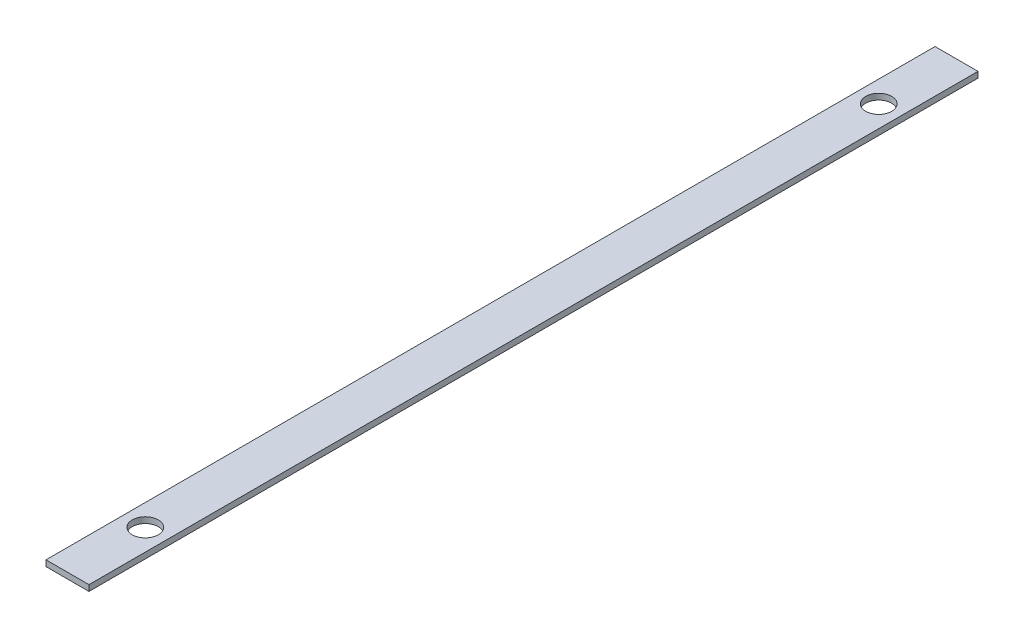
ISO-10303-21;
HEADER;
FILE_DESCRIPTION(('STEP AP214'),'2;1');
FILE_NAME('part.step','',(''),(''),'','','');
FILE_SCHEMA(('AUTOMOTIVE_DESIGN { 1 0 10303 214 1 1 1 1 }'));
ENDSEC;
DATA;
#1=APPLICATION_CONTEXT('core data for automotive mechanical design processes');
#2=APPLICATION_PROTOCOL_DEFINITION('international standard','automotive_design',2000,#1);
#3=PRODUCT_CONTEXT('',#1,'mechanical');
#4=PRODUCT('Part','Part','',(#3));
#5=PRODUCT_RELATED_PRODUCT_CATEGORY('part','',(#4));
#6=PRODUCT_DEFINITION_FORMATION('','',#4);
#7=PRODUCT_DEFINITION_CONTEXT('part definition',#1,'design');
#8=PRODUCT_DEFINITION('design','',#6,#7);
#9=PRODUCT_DEFINITION_SHAPE('','',#8);
#10=(LENGTH_UNIT() NAMED_UNIT(*) SI_UNIT(.MILLI.,.METRE.));
#11=(NAMED_UNIT(*) PLANE_ANGLE_UNIT() SI_UNIT($,.RADIAN.));
#12=(NAMED_UNIT(*) SI_UNIT($,.STERADIAN.) SOLID_ANGLE_UNIT());
#13=UNCERTAINTY_MEASURE_WITH_UNIT(LENGTH_MEASURE(1.E-05),#10,'distance_accuracy_value','');
#14=(GEOMETRIC_REPRESENTATION_CONTEXT(3) GLOBAL_UNCERTAINTY_ASSIGNED_CONTEXT((#13)) GLOBAL_UNIT_ASSIGNED_CONTEXT((#10,
#11,#12)) REPRESENTATION_CONTEXT('',''));
#15=CARTESIAN_POINT('',(0.,0.,0.));
#16=DIRECTION('',(0.,0.,1.));
#17=DIRECTION('',(1.,0.,0.));
#18=AXIS2_PLACEMENT_3D('',#15,#16,#17);
#19=CARTESIAN_POINT('',(-2.9,-0.4,60.));
#20=DIRECTION('',(1.,0.,0.));
#21=DIRECTION('',(0.,0.,-1.));
#22=AXIS2_PLACEMENT_3D('',#19,#20,#21);
#23=PLANE('',#22);
#24=DIRECTION('',(0.,-1.,0.));
#25=VECTOR('',#24,1.);
#26=CARTESIAN_POINT('',(-2.9,-0.4,-60.));
#27=LINE('',#26,#25);
#28=CARTESIAN_POINT('',(-2.9,0.4,-60.));
#29=VERTEX_POINT('',#28);
#30=CARTESIAN_POINT('',(-2.9,-0.4,-60.));
#31=VERTEX_POINT('',#30);
#32=EDGE_CURVE('E105',#29,#31,#27,.T.);
#33=ORIENTED_EDGE('',*,*,#32,.T.);
#34=DIRECTION('',(0.,0.,-1.));
#35=VECTOR('',#34,1.);
#36=CARTESIAN_POINT('',(-2.9,-0.4,60.));
#37=LINE('',#36,#35);
#38=CARTESIAN_POINT('',(-2.9,-0.4,60.));
#39=VERTEX_POINT('',#38);
#40=EDGE_CURVE('E11',#39,#31,#37,.T.);
#41=ORIENTED_EDGE('',*,*,#40,.F.);
#42=DIRECTION('',(0.,-1.,0.));
#43=VECTOR('',#42,1.);
#44=CARTESIAN_POINT('',(-2.9,-0.4,60.));
#45=LINE('',#44,#43);
#46=CARTESIAN_POINT('',(-2.9,0.4,60.));
#47=VERTEX_POINT('',#46);
#48=EDGE_CURVE('E89',#47,#39,#45,.T.);
#49=ORIENTED_EDGE('',*,*,#48,.F.);
#50=DIRECTION('',(0.,0.,-1.));
#51=VECTOR('',#50,1.);
#52=CARTESIAN_POINT('',(-2.9,0.4,60.));
#53=LINE('',#52,#51);
#54=EDGE_CURVE('E98',#47,#29,#53,.T.);
#55=ORIENTED_EDGE('',*,*,#54,.T.);
#56=EDGE_LOOP('',(#33,#41,#49,#55));
#57=FACE_BOUND('',#56,.T.);
#58=ADVANCED_FACE('F39',(#57),#23,.F.);
#59=CARTESIAN_POINT('',(-2.9,-0.4,60.));
#60=DIRECTION('',(0.,1.,0.));
#61=DIRECTION('',(0.,0.,1.));
#62=AXIS2_PLACEMENT_3D('',#59,#60,#61);
#63=PLANE('',#62);
#64=CARTESIAN_POINT('',(0.,-0.4,49.5));
#65=DIRECTION('',(0.,1.,0.));
#66=DIRECTION('',(0.,0.,1.));
#67=AXIS2_PLACEMENT_3D('',#64,#65,#66);
#68=CIRCLE('',#67,1.75);
#69=CARTESIAN_POINT('',(0.,-0.4,51.25));
#70=VERTEX_POINT('',#69);
#71=EDGE_CURVE('E104',#70,#70,#68,.F.);
#72=ORIENTED_EDGE('',*,*,#71,.F.);
#73=EDGE_LOOP('',(#72));
#74=FACE_BOUND('',#73,.T.);
#75=CARTESIAN_POINT('',(0.,-0.4,-49.5));
#76=DIRECTION('',(0.,1.,0.));
#77=DIRECTION('',(0.,0.,1.));
#78=AXIS2_PLACEMENT_3D('',#75,#76,#77);
#79=CIRCLE('',#78,1.75);
#80=CARTESIAN_POINT('',(0.,-0.4,-47.75));
#81=VERTEX_POINT('',#80);
#82=EDGE_CURVE('E118',#81,#81,#79,.F.);
#83=ORIENTED_EDGE('',*,*,#82,.F.);
#84=EDGE_LOOP('',(#83));
#85=FACE_BOUND('',#84,.T.);
#86=DIRECTION('',(1.,0.,0.));
#87=VECTOR('',#86,1.);
#88=CARTESIAN_POINT('',(-2.9,-0.4,-60.));
#89=LINE('',#88,#87);
#90=CARTESIAN_POINT('',(2.9,-0.4,-60.));
#91=VERTEX_POINT('',#90);
#92=EDGE_CURVE('E94',#31,#91,#89,.T.);
#93=ORIENTED_EDGE('',*,*,#92,.T.);
#94=DIRECTION('',(0.,0.,-1.));
#95=VECTOR('',#94,1.);
#96=CARTESIAN_POINT('',(2.9,-0.4,60.));
#97=LINE('',#96,#95);
#98=CARTESIAN_POINT('',(2.9,-0.4,60.));
#99=VERTEX_POINT('',#98);
#100=EDGE_CURVE('E50',#99,#91,#97,.T.);
#101=ORIENTED_EDGE('',*,*,#100,.F.);
#102=DIRECTION('',(1.,0.,0.));
#103=VECTOR('',#102,1.);
#104=CARTESIAN_POINT('',(-2.9,-0.4,60.));
#105=LINE('',#104,#103);
#106=EDGE_CURVE('E83',#39,#99,#105,.T.);
#107=ORIENTED_EDGE('',*,*,#106,.F.);
#108=ORIENTED_EDGE('',*,*,#40,.T.);
#109=EDGE_LOOP('',(#93,#101,#107,#108));
#110=FACE_BOUND('',#109,.T.);
#111=ADVANCED_FACE('F91',(#74,#85,#110),#63,.F.);
#112=CARTESIAN_POINT('',(2.9,-0.4,60.));
#113=DIRECTION('',(-1.,0.,0.));
#114=DIRECTION('',(0.,0.,1.));
#115=AXIS2_PLACEMENT_3D('',#112,#113,#114);
#116=PLANE('',#115);
#117=DIRECTION('',(0.,1.,0.));
#118=VECTOR('',#117,1.);
#119=CARTESIAN_POINT('',(2.9,-0.4,-60.));
#120=LINE('',#119,#118);
#121=CARTESIAN_POINT('',(2.9,0.4,-60.));
#122=VERTEX_POINT('',#121);
#123=EDGE_CURVE('E75',#91,#122,#120,.T.);
#124=ORIENTED_EDGE('',*,*,#123,.T.);
#125=DIRECTION('',(0.,0.,-1.));
#126=VECTOR('',#125,1.);
#127=CARTESIAN_POINT('',(2.9,0.4,60.));
#128=LINE('',#127,#126);
#129=CARTESIAN_POINT('',(2.9,0.4,60.));
#130=VERTEX_POINT('',#129);
#131=EDGE_CURVE('E92',#130,#122,#128,.T.);
#132=ORIENTED_EDGE('',*,*,#131,.F.);
#133=DIRECTION('',(0.,1.,0.));
#134=VECTOR('',#133,1.);
#135=CARTESIAN_POINT('',(2.9,-0.4,60.));
#136=LINE('',#135,#134);
#137=EDGE_CURVE('E86',#99,#130,#136,.T.);
#138=ORIENTED_EDGE('',*,*,#137,.F.);
#139=ORIENTED_EDGE('',*,*,#100,.T.);
#140=EDGE_LOOP('',(#124,#132,#138,#139));
#141=FACE_BOUND('',#140,.T.);
#142=ADVANCED_FACE('F96',(#141),#116,.F.);
#143=CARTESIAN_POINT('',(-2.9,0.4,60.));
#144=DIRECTION('',(0.,-1.,0.));
#145=DIRECTION('',(0.,0.,-1.));
#146=AXIS2_PLACEMENT_3D('',#143,#144,#145);
#147=PLANE('',#146);
#148=CARTESIAN_POINT('',(0.,0.4,49.5));
#149=DIRECTION('',(0.,1.,0.));
#150=DIRECTION('',(0.,0.,1.));
#151=AXIS2_PLACEMENT_3D('',#148,#149,#150);
#152=CIRCLE('',#151,1.75);
#153=CARTESIAN_POINT('',(0.,0.4,51.25));
#154=VERTEX_POINT('',#153);
#155=EDGE_CURVE('E116',#154,#154,#152,.T.);
#156=ORIENTED_EDGE('',*,*,#155,.F.);
#157=EDGE_LOOP('',(#156));
#158=FACE_BOUND('',#157,.T.);
#159=CARTESIAN_POINT('',(0.,0.4,-49.5));
#160=DIRECTION('',(0.,1.,0.));
#161=DIRECTION('',(0.,0.,-1.));
#162=AXIS2_PLACEMENT_3D('',#159,#160,#161);
#163=CIRCLE('',#162,1.75);
#164=CARTESIAN_POINT('',(0.,0.4,-51.25));
#165=VERTEX_POINT('',#164);
#166=EDGE_CURVE('E117',#165,#165,#163,.T.);
#167=ORIENTED_EDGE('',*,*,#166,.F.);
#168=EDGE_LOOP('',(#167));
#169=FACE_BOUND('',#168,.T.);
#170=DIRECTION('',(-1.,0.,0.));
#171=VECTOR('',#170,1.);
#172=CARTESIAN_POINT('',(-2.9,0.4,-60.));
#173=LINE('',#172,#171);
#174=EDGE_CURVE('E79',#122,#29,#173,.T.);
#175=ORIENTED_EDGE('',*,*,#174,.T.);
#176=ORIENTED_EDGE('',*,*,#54,.F.);
#177=DIRECTION('',(-1.,0.,0.));
#178=VECTOR('',#177,1.);
#179=CARTESIAN_POINT('',(-2.9,0.4,60.));
#180=LINE('',#179,#178);
#181=EDGE_CURVE('E54',#130,#47,#180,.T.);
#182=ORIENTED_EDGE('',*,*,#181,.F.);
#183=ORIENTED_EDGE('',*,*,#131,.T.);
#184=EDGE_LOOP('',(#175,#176,#182,#183));
#185=FACE_BOUND('',#184,.T.);
#186=ADVANCED_FACE('F109',(#158,#169,#185),#147,.F.);
#187=CARTESIAN_POINT('',(0.,0.,60.));
#188=DIRECTION('',(0.,0.,-1.));
#189=DIRECTION('',(-1.,0.,0.));
#190=AXIS2_PLACEMENT_3D('',#187,#188,#189);
#191=PLANE('',#190);
#192=ORIENTED_EDGE('',*,*,#48,.T.);
#193=ORIENTED_EDGE('',*,*,#106,.T.);
#194=ORIENTED_EDGE('',*,*,#137,.T.);
#195=ORIENTED_EDGE('',*,*,#181,.T.);
#196=EDGE_LOOP('',(#192,#193,#194,#195));
#197=FACE_BOUND('',#196,.T.);
#198=ADVANCED_FACE('F88',(#197),#191,.F.);
#199=CARTESIAN_POINT('',(0.,0.,-60.));
#200=DIRECTION('',(0.,0.,-1.));
#201=DIRECTION('',(-1.,0.,0.));
#202=AXIS2_PLACEMENT_3D('',#199,#200,#201);
#203=PLANE('',#202);
#204=ORIENTED_EDGE('',*,*,#32,.F.);
#205=ORIENTED_EDGE('',*,*,#174,.F.);
#206=ORIENTED_EDGE('',*,*,#123,.F.);
#207=ORIENTED_EDGE('',*,*,#92,.F.);
#208=EDGE_LOOP('',(#204,#205,#206,#207));
#209=FACE_BOUND('',#208,.T.);
#210=ADVANCED_FACE('F114',(#209),#203,.T.);
#211=CARTESIAN_POINT('',(0.,-5.34974746830584,-49.5));
#212=DIRECTION('',(0.,1.,0.));
#213=DIRECTION('',(0.,0.,1.));
#214=AXIS2_PLACEMENT_3D('',#211,#212,#213);
#215=CYLINDRICAL_SURFACE('',#214,1.75);
#216=ORIENTED_EDGE('',*,*,#82,.T.);
#217=EDGE_LOOP('',(#216));
#218=FACE_BOUND('',#217,.T.);
#219=ORIENTED_EDGE('',*,*,#166,.T.);
#220=EDGE_LOOP('',(#219));
#221=FACE_BOUND('',#220,.T.);
#222=ADVANCED_FACE('F133',(#218,#221),#215,.F.);
#223=CARTESIAN_POINT('',(0.,-5.34974746830584,49.5));
#224=DIRECTION('',(0.,1.,0.));
#225=DIRECTION('',(0.,0.,1.));
#226=AXIS2_PLACEMENT_3D('',#223,#224,#225);
#227=CYLINDRICAL_SURFACE('',#226,1.75);
#228=ORIENTED_EDGE('',*,*,#71,.T.);
#229=EDGE_LOOP('',(#228));
#230=FACE_BOUND('',#229,.T.);
#231=ORIENTED_EDGE('',*,*,#155,.T.);
#232=EDGE_LOOP('',(#231));
#233=FACE_BOUND('',#232,.T.);
#234=ADVANCED_FACE('F126',(#230,#233),#227,.F.);
#235=CLOSED_SHELL('',(#58,#111,#142,#186,#198,#210,#222,#234));
#236=MANIFOLD_SOLID_BREP('B2',#235);
#237=ADVANCED_BREP_SHAPE_REPRESENTATION('',(#18,#236),#14);
#238=SHAPE_DEFINITION_REPRESENTATION(#9,#237);
ENDSEC;
END-ISO-10303-21;
